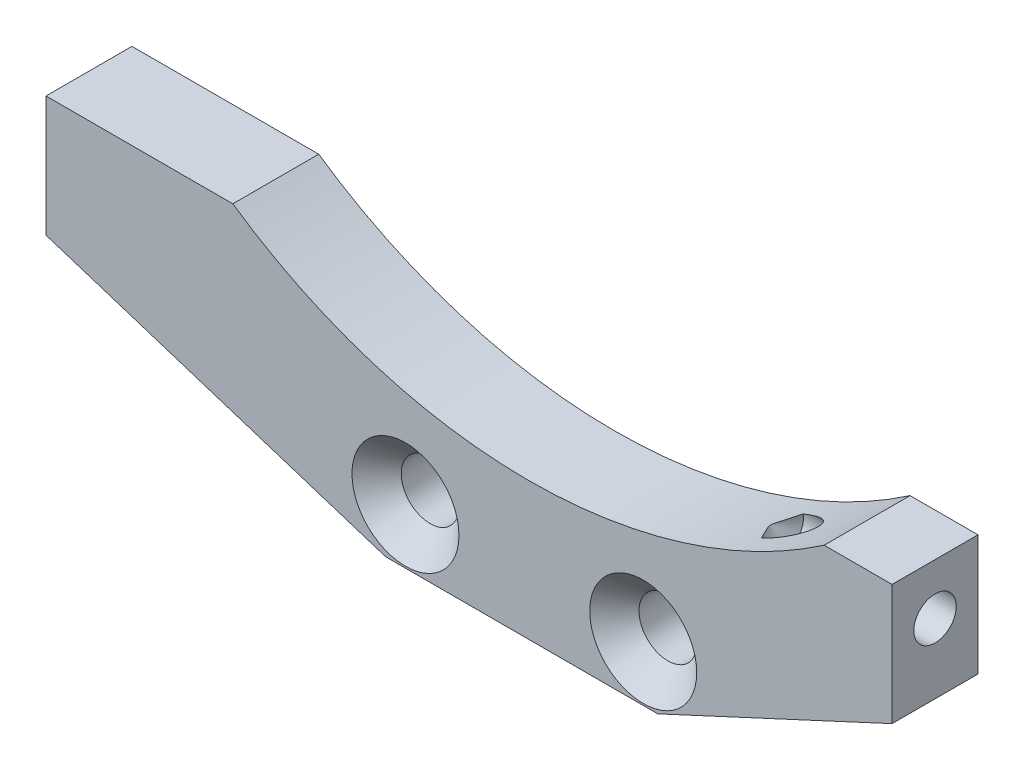
ISO-10303-21;
HEADER;
FILE_DESCRIPTION(('STEP AP214'),'2;1');
FILE_NAME('part.step','',(''),(''),'','','');
FILE_SCHEMA(('AUTOMOTIVE_DESIGN { 1 0 10303 214 1 1 1 1 }'));
ENDSEC;
DATA;
#1=APPLICATION_CONTEXT('core data for automotive mechanical design processes');
#2=APPLICATION_PROTOCOL_DEFINITION('international standard','automotive_design',2000,#1);
#3=PRODUCT_CONTEXT('',#1,'mechanical');
#4=PRODUCT('Part','Part','',(#3));
#5=PRODUCT_RELATED_PRODUCT_CATEGORY('part','',(#4));
#6=PRODUCT_DEFINITION_FORMATION('','',#4);
#7=PRODUCT_DEFINITION_CONTEXT('part definition',#1,'design');
#8=PRODUCT_DEFINITION('design','',#6,#7);
#9=PRODUCT_DEFINITION_SHAPE('','',#8);
#10=(LENGTH_UNIT() NAMED_UNIT(*) SI_UNIT(.MILLI.,.METRE.));
#11=(NAMED_UNIT(*) PLANE_ANGLE_UNIT() SI_UNIT($,.RADIAN.));
#12=(NAMED_UNIT(*) SI_UNIT($,.STERADIAN.) SOLID_ANGLE_UNIT());
#13=UNCERTAINTY_MEASURE_WITH_UNIT(LENGTH_MEASURE(1.E-05),#10,'distance_accuracy_value','');
#14=(GEOMETRIC_REPRESENTATION_CONTEXT(3) GLOBAL_UNCERTAINTY_ASSIGNED_CONTEXT((#13)) GLOBAL_UNIT_ASSIGNED_CONTEXT((#10,
#11,#12)) REPRESENTATION_CONTEXT('',''));
#15=CARTESIAN_POINT('',(0.,0.,0.));
#16=DIRECTION('',(0.,0.,1.));
#17=DIRECTION('',(1.,0.,0.));
#18=AXIS2_PLACEMENT_3D('',#15,#16,#17);
#19=CARTESIAN_POINT('',(8.40999999999999,38.8655648148148,5.06));
#20=DIRECTION('',(0.,0.,-1.));
#21=DIRECTION('',(-1.,0.,0.));
#22=AXIS2_PLACEMENT_3D('',#19,#20,#21);
#23=CYLINDRICAL_SURFACE('',#22,30.7655648148148);
#24=CARTESIAN_POINT('',(20.82,10.7139773218408,3.76154931112717));
#25=CARTESIAN_POINT('',(20.8732963721157,10.7374717622456,3.75746507488841));
#26=CARTESIAN_POINT('',(20.9264787062272,10.7610968990688,3.75267014025951));
#27=CARTESIAN_POINT('',(21.0325852986872,10.8085924493914,3.74155541351275));
#28=CARTESIAN_POINT('',(21.0855095071894,10.8324629076985,3.73523533791449));
#29=CARTESIAN_POINT('',(21.244286766152,10.9046168986034,3.71377173238336));
#30=CARTESIAN_POINT('',(21.3496724602479,10.9532349438503,3.69615906048172));
#31=CARTESIAN_POINT('',(21.5640699172926,11.0536041226936,3.65213358170872));
#32=CARTESIAN_POINT('',(21.6729838102881,11.1053863293216,3.62530940743945));
#33=CARTESIAN_POINT('',(21.8875807804305,11.2089397193795,3.56131867076748));
#34=CARTESIAN_POINT('',(21.9932701287232,11.2607107000658,3.5241738203639));
#35=CARTESIAN_POINT('',(22.1472144759952,11.3371766352407,3.45883081153227));
#36=CARTESIAN_POINT('',(22.197403203186,11.3622821821445,3.4356552015305));
#37=CARTESIAN_POINT('',(22.2961844065214,11.412023828413,3.38554841715364));
#38=CARTESIAN_POINT('',(22.3447758789975,11.4366596286693,3.35861493514785));
#39=CARTESIAN_POINT('',(22.4391408899859,11.4848059547788,3.30075063392553));
#40=CARTESIAN_POINT('',(22.4849419890738,11.5083266745834,3.26987378272924));
#41=CARTESIAN_POINT('',(22.5734406802593,11.5540398653351,3.20315284845529));
#42=CARTESIAN_POINT('',(22.6161430382544,11.576234366321,3.16731665079716));
#43=CARTESIAN_POINT('',(22.6866951429428,11.6130949954485,3.09973219756537));
#44=CARTESIAN_POINT('',(22.7155446967491,11.6282317044264,3.06929394649257));
#45=CARTESIAN_POINT('',(22.7699407815096,11.6568709279118,3.00476027362437));
#46=CARTESIAN_POINT('',(22.7954826818536,11.6703711497353,2.9706598444186));
#47=CARTESIAN_POINT('',(22.8422363419431,11.6951536929168,2.89822357428397));
#48=CARTESIAN_POINT('',(22.8633976462795,11.7064101209504,2.85984546014125));
#49=CARTESIAN_POINT('',(22.8993138250084,11.7255540808426,2.77942147653472));
#50=CARTESIAN_POINT('',(22.9140844270791,11.7334498824974,2.73738492070636));
#51=CARTESIAN_POINT('',(22.9328909496171,11.7435128777606,2.66139176175577));
#52=CARTESIAN_POINT('',(22.9386739212566,11.7466115808697,2.62799201891673));
#53=CARTESIAN_POINT('',(22.9451477855578,11.7500808217118,2.56056555974083));
#54=CARTESIAN_POINT('',(22.9458420380783,11.7504531595444,2.52653927196734));
#55=CARTESIAN_POINT('',(22.9420752051006,11.7484342092039,2.45888246250314));
#56=CARTESIAN_POINT('',(22.9376167982576,11.7460443569795,2.42525174434991));
#57=CARTESIAN_POINT('',(22.9239544593096,11.7387300733992,2.35925590401514));
#58=CARTESIAN_POINT('',(22.9147464848226,11.7338034830184,2.32689188521279));
#59=CARTESIAN_POINT('',(22.8885108989681,11.7197919250286,2.25354206939279));
#60=CARTESIAN_POINT('',(22.8698986752759,11.7098676197807,2.21328745399696));
#61=CARTESIAN_POINT('',(22.8272154827298,11.6871825438952,2.13667695147983));
#62=CARTESIAN_POINT('',(22.8031331611429,11.6744158752769,2.10032940762674));
#63=CARTESIAN_POINT('',(22.7357162737475,11.6388133797915,2.01127738790471));
#64=CARTESIAN_POINT('',(22.6893739731167,11.6144633982537,1.9614819416424));
#65=CARTESIAN_POINT('',(22.5906140570452,11.562940465325,1.87014008733521));
#66=CARTESIAN_POINT('',(22.5381818389002,11.535760745505,1.82861418303431));
#67=CARTESIAN_POINT('',(22.4317283704079,11.4809971436111,1.75399209712183));
#68=CARTESIAN_POINT('',(22.3778676875402,11.4534787813474,1.72061402012071));
#69=CARTESIAN_POINT('',(22.2676434180747,11.397592127224,1.65904777045441));
#70=CARTESIAN_POINT('',(22.2112775100425,11.3692230553299,1.63086454144074));
#71=CARTESIAN_POINT('',(22.096538959454,11.3119305586267,1.57880507166599));
#72=CARTESIAN_POINT('',(22.0381588360291,11.2830052963183,1.55494755651106));
#73=CARTESIAN_POINT('',(21.9200617641977,11.2249688987082,1.51105800333276));
#74=CARTESIAN_POINT('',(21.8603444397994,11.195857712816,1.49102705673801));
#75=CARTESIAN_POINT('',(21.720131089947,11.1280761529829,1.44828249311795));
#76=CARTESIAN_POINT('',(21.6392477730063,11.0894040745741,1.42684595521246));
#77=CARTESIAN_POINT('',(21.4761613811671,11.0123145306314,1.3890025089399));
#78=CARTESIAN_POINT('',(21.3939576359972,10.9738972093547,1.37259824577592));
#79=CARTESIAN_POINT('',(21.2301239238004,10.8982197960193,1.34445224854016));
#80=CARTESIAN_POINT('',(21.1485113859291,10.8609514339328,1.33263002044666));
#81=CARTESIAN_POINT('',(20.9846819152617,10.7870064027965,1.31279948300115));
#82=CARTESIAN_POINT('',(20.902465890001,10.7503290373206,1.3047863102913));
#83=CARTESIAN_POINT('',(20.82,10.7139773218408,1.29845068887283));
#84=B_SPLINE_CURVE_WITH_KNOTS('',3,(#24,#25,#26,#27,#28,#29,#30,#31,#32,#33,#34,#35,#36,#37,#38,
#39,#40,#41,#42,#43,#44,#45,#46,#47,#48,#49,#50,#51,#52,#53,#54,#55,#56,#57,#58,#59,#60,#61,#62,
#63,#64,#65,#66,#67,#68,#69,#70,#71,#72,#73,#74,#75,#76,#77,#78,#79,#80,#81,#82,#83),
.UNSPECIFIED.,.F.,.F.,(4,2,2,2,2,2,2,2,2,2,2,2,2,2,2,2,2,2,2,2,2,2,2,2,2,2,2,2,2,4),(0.,
0.175154654003996,0.350341889393368,0.702265161658169,1.07255842761273,1.4420785160509,
1.62411720525078,1.80626817667465,1.98615033779123,2.16574970182206,2.29927155941018,
2.43297836780396,2.56814865953419,2.7029843749715,2.80464361042627,2.90623571867952,
3.00777503712927,3.10940091917454,3.24497340363604,3.38082987091952,3.59636336612065,
3.81242478396344,4.01936349182562,4.2264981264574,4.43450906664542,4.64257924822065,
4.91893594271807,5.19543765551056,5.46683420327539,5.73788329808509),.UNSPECIFIED.);
#85=CARTESIAN_POINT('',(20.82,10.7139773218408,3.76154931112718));
#86=VERTEX_POINT('',#85);
#87=CARTESIAN_POINT('',(20.82,10.7139773218408,1.29845068887282));
#88=VERTEX_POINT('',#87);
#89=EDGE_CURVE('E11',#86,#88,#84,.T.);
#90=ORIENTED_EDGE('',*,*,#89,.F.);
#91=CARTESIAN_POINT('',(20.8953075773784,10.7472954322083,1.17708262125242));
#92=CARTESIAN_POINT('',(20.8578048702083,10.7306431135805,1.23749174126319));
#93=CARTESIAN_POINT('',(20.8203098732207,10.7140841510477,1.29793142255677));
#94=CARTESIAN_POINT('',(20.7453535952161,10.6811594642739,1.41888601863832));
#95=CARTESIAN_POINT('',(20.7078923148817,10.6647937438671,1.47940093489287));
#96=CARTESIAN_POINT('',(20.6330095343998,10.6322567668796,1.60053991247071));
#97=CARTESIAN_POINT('',(20.5955880538618,10.6160855837622,1.66116400566528));
#98=CARTESIAN_POINT('',(20.520845047145,10.5839618691481,1.78253036101301));
#99=CARTESIAN_POINT('',(20.4835235195013,10.5680093344322,1.84327262141128));
#100=CARTESIAN_POINT('',(20.4123463509373,10.5377512769652,1.95960896057011));
#101=CARTESIAN_POINT('',(20.3784739450933,10.5234240601458,2.01518709354899));
#102=CARTESIAN_POINT('',(20.3279855474267,10.5021741024857,2.09880738669123));
#103=CARTESIAN_POINT('',(20.3112099168999,10.4951311223632,2.12672221214193));
#104=CARTESIAN_POINT('',(20.2778578356196,10.4811631918628,2.18269702087441));
#105=CARTESIAN_POINT('',(20.2612813709459,10.4742382332219,2.21075699381307));
#106=CARTESIAN_POINT('',(20.2296217928804,10.4610442014895,2.26523646922904));
#107=CARTESIAN_POINT('',(20.214513671253,10.4547625079092,2.29163808903152));
#108=CARTESIAN_POINT('',(20.1924522074772,10.4456094606179,2.33165004009943));
#109=CARTESIAN_POINT('',(20.1851956572275,10.4426021839873,2.34506118733801));
#110=CARTESIAN_POINT('',(20.1710360867049,10.436740237154,2.37210028660551));
#111=CARTESIAN_POINT('',(20.1641329603869,10.4338855211638,2.38572817197436));
#112=CARTESIAN_POINT('',(20.1514828254923,10.4286591722105,2.41228645310538));
#113=CARTESIAN_POINT('',(20.1456877191382,10.4262672649663,2.42518967490754));
#114=CARTESIAN_POINT('',(20.1351614943273,10.4219258387855,2.45151972786571));
#115=CARTESIAN_POINT('',(20.1304294950325,10.4199759535991,2.46494611464761));
#116=CARTESIAN_POINT('',(20.1241902914663,10.4174061298514,2.4885760397123));
#117=CARTESIAN_POINT('',(20.1221477604113,10.4165652804167,2.4986022772974));
#118=CARTESIAN_POINT('',(20.119748706165,10.4155777196945,2.5188517587222));
#119=CARTESIAN_POINT('',(20.1193821031692,10.4154268584968,2.52907345245306));
#120=CARTESIAN_POINT('',(20.120442293909,10.4158632396464,2.54938319628751));
#121=CARTESIAN_POINT('',(20.1218670678801,10.4164496507247,2.55947138396735));
#122=CARTESIAN_POINT('',(20.1260610982273,10.4181766116298,2.57936414150032));
#123=CARTESIAN_POINT('',(20.1288402401651,10.4193212359119,2.58916605543634));
#124=CARTESIAN_POINT('',(20.1353350615572,10.421997724911,2.60875640021082));
#125=CARTESIAN_POINT('',(20.1390790436899,10.4235412973137,2.61853333663354));
#126=CARTESIAN_POINT('',(20.1471000956698,10.4268503791057,2.63783123295963));
#127=CARTESIAN_POINT('',(20.1513776377007,10.4286160850884,2.64735195693537));
#128=CARTESIAN_POINT('',(20.1647113499204,10.4341239231834,2.67570222489143));
#129=CARTESIAN_POINT('',(20.1742466486332,10.4380677340782,2.69426332624345));
#130=CARTESIAN_POINT('',(20.1939031822529,10.4462101528278,2.73113563006985));
#131=CARTESIAN_POINT('',(20.2040272749774,10.4504100091998,2.74944496804137));
#132=CARTESIAN_POINT('',(20.2245457361739,10.4589351191204,2.78583341171537));
#133=CARTESIAN_POINT('',(20.2349395368783,10.4632601111526,2.80391289789323));
#134=CARTESIAN_POINT('',(20.2660645061532,10.4762320900352,2.85747680103432));
#135=CARTESIAN_POINT('',(20.2870245790873,10.4849942366818,2.89279918249807));
#136=CARTESIAN_POINT('',(20.3291977644699,10.5026801255211,2.96325325400869));
#137=CARTESIAN_POINT('',(20.3504108903255,10.5116038762889,2.99838493380723));
#138=CARTESIAN_POINT('',(20.4142770165299,10.5385556947621,3.10367640913191));
#139=CARTESIAN_POINT('',(20.4571232012558,10.5567503451315,3.17367628884129));
#140=CARTESIAN_POINT('',(20.5427933759433,10.5933617271433,3.31317147586966));
#141=CARTESIAN_POINT('',(20.5856165832239,10.6117770751814,3.38266763102458));
#142=CARTESIAN_POINT('',(20.6713432529768,10.6488743599787,3.52151773543933));
#143=CARTESIAN_POINT('',(20.714246696346,10.6675562389353,3.5908717119114));
#144=CARTESIAN_POINT('',(20.7801650191034,10.6964394092128,3.69729594322209));
#145=CARTESIAN_POINT('',(20.8031631866347,10.7065499745383,3.73440122674062));
#146=CARTESIAN_POINT('',(20.8492087565658,10.7268601881856,3.80864759495957));
#147=CARTESIAN_POINT('',(20.8722561768948,10.7370599573849,3.84578863547571));
#148=CARTESIAN_POINT('',(20.8953075773784,10.7472954322083,3.88291737874758));
#149=B_SPLINE_CURVE_WITH_KNOTS('',3,(#91,#92,#93,#94,#95,#96,#97,#98,#99,#100,#101,#102,#103,
#104,#105,#106,#107,#108,#109,#110,#111,#112,#113,#114,#115,#116,#117,#118,#119,#120,#121,#122,
#123,#124,#125,#126,#127,#128,#129,#130,#131,#132,#133,#134,#135,#136,#137,#138,#139,#140,#141,
#142,#143,#144,#145,#146,#147,#148),.UNSPECIFIED.,.F.,.F.,(4,2,2,2,2,2,2,2,2,2,2,2,2,2,2,2,2,2,
2,2,2,2,2,2,2,2,2,2,4),(0.,0.219082454006425,0.438169247750999,0.657336330378651,
0.876500182626039,1.07643322121192,1.17639412347633,1.27634799810078,1.36951949168819,
1.41614344467403,1.46275332513016,1.50577155432175,1.54875400819385,1.57943566700475,
1.60993254726739,1.6403950733345,1.67108335385298,1.70280163755462,1.73454819278406,
1.79822468865371,1.86224132526599,1.92613266806824,2.05212070186443,2.17811544054278,
2.43030610106092,2.68135159817771,2.9323434545622,3.06677357869673,3.20142894581246),.UNSPECIFIED.);
#150=EDGE_CURVE('E48',#88,#86,#149,.T.);
#151=ORIENTED_EDGE('',*,*,#150,.F.);
#152=EDGE_LOOP('',(#90,#151));
#153=FACE_BOUND('',#152,.T.);
#154=CARTESIAN_POINT('',(8.40999999999999,38.8655648148148,0.));
#155=DIRECTION('',(0.,0.,1.));
#156=DIRECTION('',(1.,0.,0.));
#157=AXIS2_PLACEMENT_3D('',#154,#155,#156);
#158=CIRCLE('',#157,30.7655648148148);
#159=CARTESIAN_POINT('',(-9.00000000000001,13.5,0.));
#160=VERTEX_POINT('',#159);
#161=CARTESIAN_POINT('',(25.82,13.5,0.));
#162=VERTEX_POINT('',#161);
#163=EDGE_CURVE('E146',#160,#162,#158,.T.);
#164=ORIENTED_EDGE('',*,*,#163,.F.);
#165=DIRECTION('',(0.,0.,-1.));
#166=VECTOR('',#165,1.);
#167=CARTESIAN_POINT('',(-9.00000000000001,13.5,5.06));
#168=LINE('',#167,#166);
#169=CARTESIAN_POINT('',(-9.00000000000001,13.5,5.06));
#170=VERTEX_POINT('',#169);
#171=EDGE_CURVE('E100',#170,#160,#168,.T.);
#172=ORIENTED_EDGE('',*,*,#171,.F.);
#173=CARTESIAN_POINT('',(8.40999999999999,38.8655648148148,5.06));
#174=DIRECTION('',(0.,0.,1.));
#175=DIRECTION('',(1.,0.,0.));
#176=AXIS2_PLACEMENT_3D('',#173,#174,#175);
#177=CIRCLE('',#176,30.7655648148148);
#178=CARTESIAN_POINT('',(25.82,13.5,5.06));
#179=VERTEX_POINT('',#178);
#180=EDGE_CURVE('E246',#170,#179,#177,.T.);
#181=ORIENTED_EDGE('',*,*,#180,.T.);
#182=DIRECTION('',(0.,0.,-1.));
#183=VECTOR('',#182,1.);
#184=CARTESIAN_POINT('',(25.82,13.5,5.06));
#185=LINE('',#184,#183);
#186=EDGE_CURVE('E95',#179,#162,#185,.T.);
#187=ORIENTED_EDGE('',*,*,#186,.T.);
#188=EDGE_LOOP('',(#164,#172,#181,#187));
#189=FACE_BOUND('',#188,.T.);
#190=ADVANCED_FACE('F36',(#153,#189),#23,.F.);
#191=CARTESIAN_POINT('',(0.,13.5,5.06));
#192=DIRECTION('',(0.,-1.,0.));
#193=DIRECTION('',(1.,0.,0.));
#194=AXIS2_PLACEMENT_3D('',#191,#192,#193);
#195=PLANE('',#194);
#196=DIRECTION('',(-1.,0.,0.));
#197=VECTOR('',#196,1.);
#198=CARTESIAN_POINT('',(0.,13.5,0.));
#199=LINE('',#198,#197);
#200=CARTESIAN_POINT('',(-20.,13.5,0.));
#201=VERTEX_POINT('',#200);
#202=EDGE_CURVE('E149',#160,#201,#199,.T.);
#203=ORIENTED_EDGE('',*,*,#202,.T.);
#204=DIRECTION('',(0.,0.,-1.));
#205=VECTOR('',#204,1.);
#206=CARTESIAN_POINT('',(-20.,13.5,5.06));
#207=LINE('',#206,#205);
#208=CARTESIAN_POINT('',(-20.,13.5,5.06));
#209=VERTEX_POINT('',#208);
#210=EDGE_CURVE('E171',#209,#201,#207,.T.);
#211=ORIENTED_EDGE('',*,*,#210,.F.);
#212=DIRECTION('',(-1.,0.,0.));
#213=VECTOR('',#212,1.);
#214=CARTESIAN_POINT('',(0.,13.5,5.06));
#215=LINE('',#214,#213);
#216=EDGE_CURVE('E143',#170,#209,#215,.T.);
#217=ORIENTED_EDGE('',*,*,#216,.F.);
#218=ORIENTED_EDGE('',*,*,#171,.T.);
#219=EDGE_LOOP('',(#203,#211,#217,#218));
#220=FACE_BOUND('',#219,.T.);
#221=ADVANCED_FACE('F204',(#220),#195,.F.);
#222=CARTESIAN_POINT('',(-20.,0.,5.06));
#223=DIRECTION('',(1.,0.,0.));
#224=DIRECTION('',(0.,0.,-1.));
#225=AXIS2_PLACEMENT_3D('',#222,#223,#224);
#226=PLANE('',#225);
#227=CARTESIAN_POINT('',(-20.,10.5,2.53));
#228=DIRECTION('',(-1.,0.,0.));
#229=DIRECTION('',(0.,0.,1.));
#230=AXIS2_PLACEMENT_3D('',#227,#228,#229);
#231=CIRCLE('',#230,1.24999999999999);
#232=CARTESIAN_POINT('',(-20.,10.5,3.77999999999999));
#233=VERTEX_POINT('',#232);
#234=EDGE_CURVE('E251',#233,#233,#231,.T.);
#235=ORIENTED_EDGE('',*,*,#234,.F.);
#236=EDGE_LOOP('',(#235));
#237=FACE_BOUND('',#236,.T.);
#238=DIRECTION('',(0.,-1.,0.));
#239=VECTOR('',#238,1.);
#240=CARTESIAN_POINT('',(-20.,0.,0.));
#241=LINE('',#240,#239);
#242=CARTESIAN_POINT('',(-20.,6.4,0.));
#243=VERTEX_POINT('',#242);
#244=EDGE_CURVE('E152',#201,#243,#241,.T.);
#245=ORIENTED_EDGE('',*,*,#244,.T.);
#246=DIRECTION('',(0.,0.,-1.));
#247=VECTOR('',#246,1.);
#248=CARTESIAN_POINT('',(-20.,6.4,5.06));
#249=LINE('',#248,#247);
#250=CARTESIAN_POINT('',(-20.,6.4,5.06));
#251=VERTEX_POINT('',#250);
#252=EDGE_CURVE('E168',#251,#243,#249,.T.);
#253=ORIENTED_EDGE('',*,*,#252,.F.);
#254=DIRECTION('',(0.,-1.,0.));
#255=VECTOR('',#254,1.);
#256=CARTESIAN_POINT('',(-20.,0.,5.06));
#257=LINE('',#256,#255);
#258=EDGE_CURVE('E241',#209,#251,#257,.T.);
#259=ORIENTED_EDGE('',*,*,#258,.F.);
#260=ORIENTED_EDGE('',*,*,#210,.T.);
#261=EDGE_LOOP('',(#245,#253,#259,#260));
#262=FACE_BOUND('',#261,.T.);
#263=ADVANCED_FACE('F216',(#237,#262),#226,.F.);
#264=CARTESIAN_POINT('',(0.,0.,5.06));
#265=DIRECTION('',(0.304775727103784,0.952424147199324,0.));
#266=DIRECTION('',(-0.952424147199324,0.304775727103784,0.));
#267=AXIS2_PLACEMENT_3D('',#264,#265,#266);
#268=PLANE('',#267);
#269=DIRECTION('',(0.952424147199324,-0.304775727103784,0.));
#270=VECTOR('',#269,1.);
#271=CARTESIAN_POINT('',(0.,0.,0.));
#272=LINE('',#271,#270);
#273=CARTESIAN_POINT('',(0.,0.,0.));
#274=VERTEX_POINT('',#273);
#275=EDGE_CURVE('E155',#243,#274,#272,.T.);
#276=ORIENTED_EDGE('',*,*,#275,.T.);
#277=DIRECTION('',(0.,0.,-1.));
#278=VECTOR('',#277,1.);
#279=CARTESIAN_POINT('',(0.,0.,5.06));
#280=LINE('',#279,#278);
#281=CARTESIAN_POINT('',(0.,0.,5.06));
#282=VERTEX_POINT('',#281);
#283=EDGE_CURVE('E165',#282,#274,#280,.T.);
#284=ORIENTED_EDGE('',*,*,#283,.F.);
#285=DIRECTION('',(0.952424147199324,-0.304775727103784,0.));
#286=VECTOR('',#285,1.);
#287=CARTESIAN_POINT('',(0.,0.,5.06));
#288=LINE('',#287,#286);
#289=EDGE_CURVE('E243',#251,#282,#288,.T.);
#290=ORIENTED_EDGE('',*,*,#289,.F.);
#291=ORIENTED_EDGE('',*,*,#252,.T.);
#292=EDGE_LOOP('',(#276,#284,#290,#291));
#293=FACE_BOUND('',#292,.T.);
#294=ADVANCED_FACE('F213',(#293),#268,.F.);
#295=CARTESIAN_POINT('',(0.,0.,5.06));
#296=DIRECTION('',(0.,1.,0.));
#297=DIRECTION('',(0.,0.,1.));
#298=AXIS2_PLACEMENT_3D('',#295,#296,#297);
#299=PLANE('',#298);
#300=DIRECTION('',(1.,0.,0.));
#301=VECTOR('',#300,1.);
#302=CARTESIAN_POINT('',(0.,0.,0.));
#303=LINE('',#302,#301);
#304=CARTESIAN_POINT('',(16.02,0.,0.));
#305=VERTEX_POINT('',#304);
#306=EDGE_CURVE('E157',#274,#305,#303,.T.);
#307=ORIENTED_EDGE('',*,*,#306,.T.);
#308=DIRECTION('',(0.,0.,-1.));
#309=VECTOR('',#308,1.);
#310=CARTESIAN_POINT('',(16.02,0.,5.06));
#311=LINE('',#310,#309);
#312=CARTESIAN_POINT('',(16.02,0.,5.06));
#313=VERTEX_POINT('',#312);
#314=EDGE_CURVE('E136',#313,#305,#311,.T.);
#315=ORIENTED_EDGE('',*,*,#314,.F.);
#316=DIRECTION('',(1.,0.,0.));
#317=VECTOR('',#316,1.);
#318=CARTESIAN_POINT('',(0.,0.,5.06));
#319=LINE('',#318,#317);
#320=EDGE_CURVE('E124',#282,#313,#319,.T.);
#321=ORIENTED_EDGE('',*,*,#320,.F.);
#322=ORIENTED_EDGE('',*,*,#283,.T.);
#323=EDGE_LOOP('',(#307,#315,#321,#322));
#324=FACE_BOUND('',#323,.T.);
#325=ADVANCED_FACE('F210',(#324),#299,.F.);
#326=CARTESIAN_POINT('',(2.83569230769231,-6.11446153846154,5.06));
#327=DIRECTION('',(-0.42072497827748,0.907188234410816,0.));
#328=DIRECTION('',(-0.907188234410816,-0.42072497827748,0.));
#329=AXIS2_PLACEMENT_3D('',#326,#327,#328);
#330=PLANE('',#329);
#331=DIRECTION('',(0.907188234410816,0.42072497827748,0.));
#332=VECTOR('',#331,1.);
#333=CARTESIAN_POINT('',(2.83569230769231,-6.11446153846154,0.));
#334=LINE('',#333,#332);
#335=CARTESIAN_POINT('',(29.82,6.4,0.));
#336=VERTEX_POINT('',#335);
#337=EDGE_CURVE('E133',#305,#336,#334,.T.);
#338=ORIENTED_EDGE('',*,*,#337,.T.);
#339=DIRECTION('',(0.,0.,-1.));
#340=VECTOR('',#339,1.);
#341=CARTESIAN_POINT('',(29.82,6.4,5.06));
#342=LINE('',#341,#340);
#343=CARTESIAN_POINT('',(29.82,6.4,5.06));
#344=VERTEX_POINT('',#343);
#345=EDGE_CURVE('E130',#344,#336,#342,.T.);
#346=ORIENTED_EDGE('',*,*,#345,.F.);
#347=DIRECTION('',(0.907188234410816,0.42072497827748,0.));
#348=VECTOR('',#347,1.);
#349=CARTESIAN_POINT('',(2.83569230769231,-6.11446153846154,5.06));
#350=LINE('',#349,#348);
#351=EDGE_CURVE('E117',#313,#344,#350,.T.);
#352=ORIENTED_EDGE('',*,*,#351,.F.);
#353=ORIENTED_EDGE('',*,*,#314,.T.);
#354=EDGE_LOOP('',(#338,#346,#352,#353));
#355=FACE_BOUND('',#354,.T.);
#356=ADVANCED_FACE('F131',(#355),#330,.F.);
#357=CARTESIAN_POINT('',(29.82,0.,5.06));
#358=DIRECTION('',(-1.,0.,0.));
#359=DIRECTION('',(0.,-1.,0.));
#360=AXIS2_PLACEMENT_3D('',#357,#358,#359);
#361=PLANE('',#360);
#362=CARTESIAN_POINT('',(29.82,10.5,2.53));
#363=DIRECTION('',(1.,0.,0.));
#364=DIRECTION('',(0.,0.,-1.));
#365=AXIS2_PLACEMENT_3D('',#362,#363,#364);
#366=CIRCLE('',#365,1.24999999999999);
#367=CARTESIAN_POINT('',(29.82,10.5,1.28000000000001));
#368=VERTEX_POINT('',#367);
#369=EDGE_CURVE('E255',#368,#368,#366,.T.);
#370=ORIENTED_EDGE('',*,*,#369,.F.);
#371=EDGE_LOOP('',(#370));
#372=FACE_BOUND('',#371,.T.);
#373=DIRECTION('',(0.,1.,0.));
#374=VECTOR('',#373,1.);
#375=CARTESIAN_POINT('',(29.82,0.,0.));
#376=LINE('',#375,#374);
#377=CARTESIAN_POINT('',(29.82,13.5,0.));
#378=VERTEX_POINT('',#377);
#379=EDGE_CURVE('E160',#336,#378,#376,.T.);
#380=ORIENTED_EDGE('',*,*,#379,.T.);
#381=DIRECTION('',(0.,0.,-1.));
#382=VECTOR('',#381,1.);
#383=CARTESIAN_POINT('',(29.82,13.5,5.06));
#384=LINE('',#383,#382);
#385=CARTESIAN_POINT('',(29.82,13.5,5.06));
#386=VERTEX_POINT('',#385);
#387=EDGE_CURVE('E137',#386,#378,#384,.T.);
#388=ORIENTED_EDGE('',*,*,#387,.F.);
#389=DIRECTION('',(0.,1.,0.));
#390=VECTOR('',#389,1.);
#391=CARTESIAN_POINT('',(29.82,0.,5.06));
#392=LINE('',#391,#390);
#393=EDGE_CURVE('E121',#344,#386,#392,.T.);
#394=ORIENTED_EDGE('',*,*,#393,.F.);
#395=ORIENTED_EDGE('',*,*,#345,.T.);
#396=EDGE_LOOP('',(#380,#388,#394,#395));
#397=FACE_BOUND('',#396,.T.);
#398=ADVANCED_FACE('F139',(#372,#397),#361,.F.);
#399=EDGE_CURVE('E153',#378,#162,#199,.T.);
#400=ORIENTED_EDGE('',*,*,#399,.T.);
#401=ORIENTED_EDGE('',*,*,#186,.F.);
#402=EDGE_CURVE('E62',#386,#179,#215,.T.);
#403=ORIENTED_EDGE('',*,*,#402,.F.);
#404=ORIENTED_EDGE('',*,*,#387,.T.);
#405=EDGE_LOOP('',(#400,#401,#403,#404));
#406=FACE_BOUND('',#405,.T.);
#407=ADVANCED_FACE('F196',(#406),#195,.F.);
#408=CARTESIAN_POINT('',(0.,0.,5.06));
#409=DIRECTION('',(0.,0.,1.));
#410=DIRECTION('',(1.,0.,0.));
#411=AXIS2_PLACEMENT_3D('',#408,#409,#410);
#412=PLANE('',#411);
#413=CARTESIAN_POINT('',(1.16687164443313,3.25000000000045,5.06));
#414=DIRECTION('',(0.,0.,1.));
#415=DIRECTION('',(1.,0.,0.));
#416=AXIS2_PLACEMENT_3D('',#413,#414,#415);
#417=CIRCLE('',#416,3.15);
#418=CARTESIAN_POINT('',(4.31687164443313,3.25000000000045,5.06));
#419=VERTEX_POINT('',#418);
#420=EDGE_CURVE('E273',#419,#419,#417,.T.);
#421=ORIENTED_EDGE('',*,*,#420,.F.);
#422=EDGE_LOOP('',(#421));
#423=FACE_BOUND('',#422,.T.);
#424=CARTESIAN_POINT('',(15.1668716444331,3.25000000000045,5.06));
#425=DIRECTION('',(0.,0.,1.));
#426=DIRECTION('',(1.,0.,0.));
#427=AXIS2_PLACEMENT_3D('',#424,#425,#426);
#428=CIRCLE('',#427,3.15);
#429=CARTESIAN_POINT('',(18.3168716444331,3.25000000000045,5.06));
#430=VERTEX_POINT('',#429);
#431=EDGE_CURVE('E264',#430,#430,#428,.T.);
#432=ORIENTED_EDGE('',*,*,#431,.F.);
#433=EDGE_LOOP('',(#432));
#434=FACE_BOUND('',#433,.T.);
#435=ORIENTED_EDGE('',*,*,#180,.F.);
#436=ORIENTED_EDGE('',*,*,#216,.T.);
#437=ORIENTED_EDGE('',*,*,#258,.T.);
#438=ORIENTED_EDGE('',*,*,#289,.T.);
#439=ORIENTED_EDGE('',*,*,#320,.T.);
#440=ORIENTED_EDGE('',*,*,#351,.T.);
#441=ORIENTED_EDGE('',*,*,#393,.T.);
#442=ORIENTED_EDGE('',*,*,#402,.T.);
#443=EDGE_LOOP('',(#435,#436,#437,#438,#439,#440,#441,#442));
#444=FACE_BOUND('',#443,.T.);
#445=ADVANCED_FACE('F119',(#423,#434,#444),#412,.T.);
#446=CARTESIAN_POINT('',(0.,0.,0.));
#447=DIRECTION('',(0.,0.,1.));
#448=DIRECTION('',(1.,0.,0.));
#449=AXIS2_PLACEMENT_3D('',#446,#447,#448);
#450=PLANE('',#449);
#451=CARTESIAN_POINT('',(1.16687164443313,3.25000000000045,0.));
#452=DIRECTION('',(0.,0.,1.));
#453=DIRECTION('',(1.,0.,0.));
#454=AXIS2_PLACEMENT_3D('',#451,#452,#453);
#455=CIRCLE('',#454,1.69999999999999);
#456=CARTESIAN_POINT('',(2.86687164443312,3.25000000000045,0.));
#457=VERTEX_POINT('',#456);
#458=EDGE_CURVE('E267',#457,#457,#455,.T.);
#459=ORIENTED_EDGE('',*,*,#458,.T.);
#460=EDGE_LOOP('',(#459));
#461=FACE_BOUND('',#460,.T.);
#462=CARTESIAN_POINT('',(15.1668716444331,3.25000000000045,0.));
#463=DIRECTION('',(0.,0.,1.));
#464=DIRECTION('',(1.,0.,0.));
#465=AXIS2_PLACEMENT_3D('',#462,#463,#464);
#466=CIRCLE('',#465,1.69999999999999);
#467=CARTESIAN_POINT('',(16.8668716444331,3.25000000000045,0.));
#468=VERTEX_POINT('',#467);
#469=EDGE_CURVE('E258',#468,#468,#466,.T.);
#470=ORIENTED_EDGE('',*,*,#469,.T.);
#471=EDGE_LOOP('',(#470));
#472=FACE_BOUND('',#471,.T.);
#473=ORIENTED_EDGE('',*,*,#163,.T.);
#474=ORIENTED_EDGE('',*,*,#399,.F.);
#475=ORIENTED_EDGE('',*,*,#379,.F.);
#476=ORIENTED_EDGE('',*,*,#337,.F.);
#477=ORIENTED_EDGE('',*,*,#306,.F.);
#478=ORIENTED_EDGE('',*,*,#275,.F.);
#479=ORIENTED_EDGE('',*,*,#244,.F.);
#480=ORIENTED_EDGE('',*,*,#202,.F.);
#481=EDGE_LOOP('',(#473,#474,#475,#476,#477,#478,#479,#480));
#482=FACE_BOUND('',#481,.T.);
#483=ADVANCED_FACE('F192',(#461,#472,#482),#450,.F.);
#484=CARTESIAN_POINT('',(-11.,10.5,2.53));
#485=DIRECTION('',(-1.,0.,0.));
#486=DIRECTION('',(0.,0.,1.));
#487=AXIS2_PLACEMENT_3D('',#484,#485,#486);
#488=CONICAL_SURFACE('',#487,1.25,1.02974425867665);
#489=CARTESIAN_POINT('',(-10.2489242262155,10.5,2.53));
#490=VERTEX_POINT('',#489);
#491=VERTEX_LOOP('',#490);
#492=FACE_BOUND('',#491,.T.);
#493=CARTESIAN_POINT('',(-11.,10.5,2.53));
#494=DIRECTION('',(-1.,0.,0.));
#495=DIRECTION('',(0.,0.,1.));
#496=AXIS2_PLACEMENT_3D('',#493,#494,#495);
#497=CIRCLE('',#496,1.25);
#498=CARTESIAN_POINT('',(-11.,10.5,3.78));
#499=VERTEX_POINT('',#498);
#500=EDGE_CURVE('E150',#499,#499,#497,.T.);
#501=ORIENTED_EDGE('',*,*,#500,.T.);
#502=EDGE_LOOP('',(#501));
#503=FACE_BOUND('',#502,.T.);
#504=ADVANCED_FACE('F188',(#492,#503),#488,.F.);
#505=CARTESIAN_POINT('',(-20.,10.5,2.53));
#506=DIRECTION('',(-1.,0.,0.));
#507=DIRECTION('',(0.,0.,1.));
#508=AXIS2_PLACEMENT_3D('',#505,#506,#507);
#509=CYLINDRICAL_SURFACE('',#508,1.24999999999999);
#510=ORIENTED_EDGE('',*,*,#500,.F.);
#511=EDGE_LOOP('',(#510));
#512=FACE_BOUND('',#511,.T.);
#513=ORIENTED_EDGE('',*,*,#234,.T.);
#514=EDGE_LOOP('',(#513));
#515=FACE_BOUND('',#514,.T.);
#516=ADVANCED_FACE('F183',(#512,#515),#509,.F.);
#517=CARTESIAN_POINT('',(20.82,10.5,2.53));
#518=DIRECTION('',(1.,0.,0.));
#519=DIRECTION('',(0.,0.,-1.));
#520=AXIS2_PLACEMENT_3D('',#517,#518,#519);
#521=CONICAL_SURFACE('',#520,1.25,1.02974425867665);
#522=ORIENTED_EDGE('',*,*,#150,.T.);
#523=CARTESIAN_POINT('',(20.82,10.5,2.53));
#524=DIRECTION('',(1.,0.,0.));
#525=DIRECTION('',(0.,0.,-1.));
#526=AXIS2_PLACEMENT_3D('',#523,#524,#525);
#527=CIRCLE('',#526,1.25);
#528=EDGE_CURVE('E54',#86,#88,#527,.T.);
#529=ORIENTED_EDGE('',*,*,#528,.T.);
#530=EDGE_LOOP('',(#522,#529));
#531=FACE_BOUND('',#530,.T.);
#532=ADVANCED_FACE('F178',(#531),#521,.F.);
#533=CARTESIAN_POINT('',(29.82,10.5,2.53));
#534=DIRECTION('',(1.,0.,0.));
#535=DIRECTION('',(0.,0.,-1.));
#536=AXIS2_PLACEMENT_3D('',#533,#534,#535);
#537=CYLINDRICAL_SURFACE('',#536,1.24999999999999);
#538=ORIENTED_EDGE('',*,*,#89,.T.);
#539=ORIENTED_EDGE('',*,*,#528,.F.);
#540=EDGE_LOOP('',(#538,#539));
#541=FACE_BOUND('',#540,.T.);
#542=ORIENTED_EDGE('',*,*,#369,.T.);
#543=EDGE_LOOP('',(#542));
#544=FACE_BOUND('',#543,.T.);
#545=ADVANCED_FACE('F182',(#541,#544),#537,.F.);
#546=CARTESIAN_POINT('',(15.1668716444331,3.25000000000045,5.06));
#547=DIRECTION('',(0.,0.,1.));
#548=DIRECTION('',(1.,0.,0.));
#549=AXIS2_PLACEMENT_3D('',#546,#547,#548);
#550=CYLINDRICAL_SURFACE('',#549,1.69999999999999);
#551=ORIENTED_EDGE('',*,*,#469,.F.);
#552=EDGE_LOOP('',(#551));
#553=FACE_BOUND('',#552,.T.);
#554=CARTESIAN_POINT('',(15.1668716444331,3.25000000000045,3.60999999999999));
#555=DIRECTION('',(0.,0.,1.));
#556=DIRECTION('',(1.,0.,0.));
#557=AXIS2_PLACEMENT_3D('',#554,#555,#556);
#558=CIRCLE('',#557,1.69999999999999);
#559=CARTESIAN_POINT('',(16.8668716444331,3.25000000000045,3.60999999999999));
#560=VERTEX_POINT('',#559);
#561=EDGE_CURVE('E261',#560,#560,#558,.T.);
#562=ORIENTED_EDGE('',*,*,#561,.T.);
#563=EDGE_LOOP('',(#562));
#564=FACE_BOUND('',#563,.T.);
#565=ADVANCED_FACE('F284',(#553,#564),#550,.F.);
#566=CARTESIAN_POINT('',(15.1668716444331,3.25000000000045,5.06));
#567=DIRECTION('',(0.,0.,1.));
#568=DIRECTION('',(1.,0.,0.));
#569=AXIS2_PLACEMENT_3D('',#566,#567,#568);
#570=CONICAL_SURFACE('',#569,3.15,0.78539816339745);
#571=ORIENTED_EDGE('',*,*,#561,.F.);
#572=EDGE_LOOP('',(#571));
#573=FACE_BOUND('',#572,.T.);
#574=ORIENTED_EDGE('',*,*,#431,.T.);
#575=EDGE_LOOP('',(#574));
#576=FACE_BOUND('',#575,.T.);
#577=ADVANCED_FACE('F281',(#573,#576),#570,.F.);
#578=CARTESIAN_POINT('',(1.16687164443313,3.25000000000045,5.06));
#579=DIRECTION('',(0.,0.,1.));
#580=DIRECTION('',(1.,0.,0.));
#581=AXIS2_PLACEMENT_3D('',#578,#579,#580);
#582=CYLINDRICAL_SURFACE('',#581,1.69999999999999);
#583=ORIENTED_EDGE('',*,*,#458,.F.);
#584=EDGE_LOOP('',(#583));
#585=FACE_BOUND('',#584,.T.);
#586=CARTESIAN_POINT('',(1.16687164443313,3.25000000000045,3.60999999999999));
#587=DIRECTION('',(0.,0.,1.));
#588=DIRECTION('',(1.,0.,0.));
#589=AXIS2_PLACEMENT_3D('',#586,#587,#588);
#590=CIRCLE('',#589,1.69999999999999);
#591=CARTESIAN_POINT('',(2.86687164443312,3.25000000000045,3.60999999999999));
#592=VERTEX_POINT('',#591);
#593=EDGE_CURVE('E270',#592,#592,#590,.T.);
#594=ORIENTED_EDGE('',*,*,#593,.T.);
#595=EDGE_LOOP('',(#594));
#596=FACE_BOUND('',#595,.T.);
#597=ADVANCED_FACE('F283',(#585,#596),#582,.F.);
#598=CARTESIAN_POINT('',(1.16687164443313,3.25000000000045,5.06));
#599=DIRECTION('',(0.,0.,1.));
#600=DIRECTION('',(1.,0.,0.));
#601=AXIS2_PLACEMENT_3D('',#598,#599,#600);
#602=CONICAL_SURFACE('',#601,3.15,0.78539816339745);
#603=ORIENTED_EDGE('',*,*,#593,.F.);
#604=EDGE_LOOP('',(#603));
#605=FACE_BOUND('',#604,.T.);
#606=ORIENTED_EDGE('',*,*,#420,.T.);
#607=EDGE_LOOP('',(#606));
#608=FACE_BOUND('',#607,.T.);
#609=ADVANCED_FACE('F277',(#605,#608),#602,.F.);
#610=CLOSED_SHELL('',(#190,#221,#263,#294,#325,#356,#398,#407,#445,#483,#504,#516,#532,#545,
#565,#577,#597,#609));
#611=MANIFOLD_SOLID_BREP('B2',#610);
#612=ADVANCED_BREP_SHAPE_REPRESENTATION('',(#18,#611),#14);
#613=SHAPE_DEFINITION_REPRESENTATION(#9,#612);
ENDSEC;
END-ISO-10303-21;
